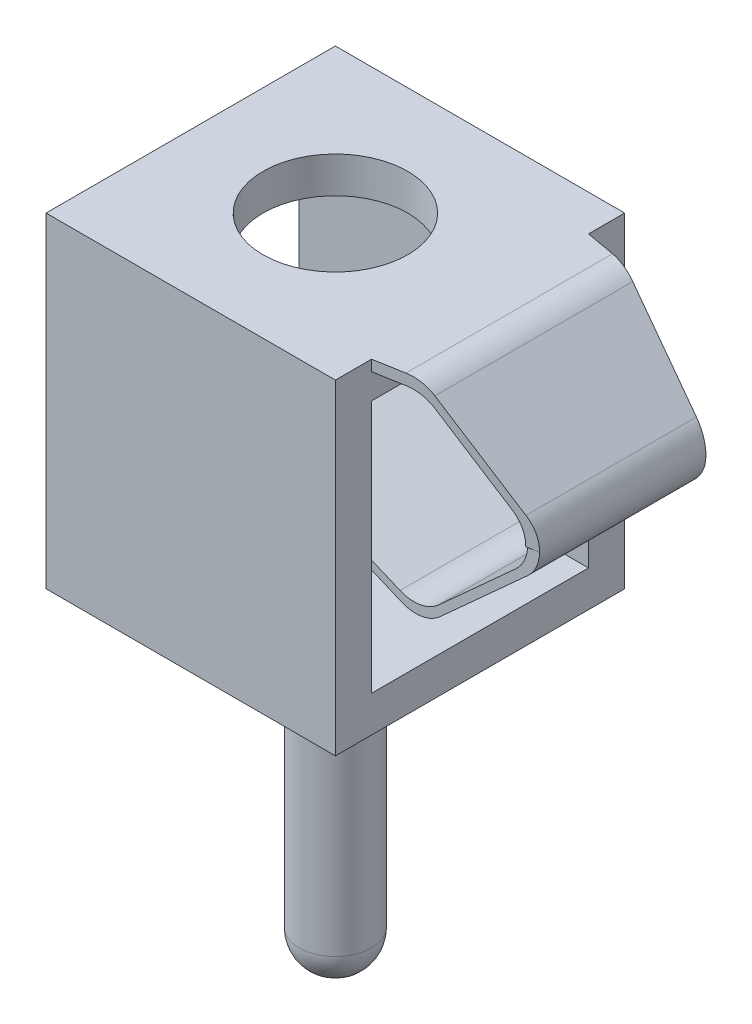
ISO-10303-21;
HEADER;
FILE_DESCRIPTION(('STEP AP214'),'2;1');
FILE_NAME('part.step','',(''),(''),'','','');
FILE_SCHEMA(('AUTOMOTIVE_DESIGN { 1 0 10303 214 1 1 1 1 }'));
ENDSEC;
DATA;
#1=APPLICATION_CONTEXT('core data for automotive mechanical design processes');
#2=APPLICATION_PROTOCOL_DEFINITION('international standard','automotive_design',2000,#1);
#3=PRODUCT_CONTEXT('',#1,'mechanical');
#4=PRODUCT('Part','Part','',(#3));
#5=PRODUCT_RELATED_PRODUCT_CATEGORY('part','',(#4));
#6=PRODUCT_DEFINITION_FORMATION('','',#4);
#7=PRODUCT_DEFINITION_CONTEXT('part definition',#1,'design');
#8=PRODUCT_DEFINITION('design','',#6,#7);
#9=PRODUCT_DEFINITION_SHAPE('','',#8);
#10=(LENGTH_UNIT() NAMED_UNIT(*) SI_UNIT(.MILLI.,.METRE.));
#11=(NAMED_UNIT(*) PLANE_ANGLE_UNIT() SI_UNIT($,.RADIAN.));
#12=(NAMED_UNIT(*) SI_UNIT($,.STERADIAN.) SOLID_ANGLE_UNIT());
#13=UNCERTAINTY_MEASURE_WITH_UNIT(LENGTH_MEASURE(1.E-05),#10,'distance_accuracy_value','');
#14=(GEOMETRIC_REPRESENTATION_CONTEXT(3) GLOBAL_UNCERTAINTY_ASSIGNED_CONTEXT((#13)) GLOBAL_UNIT_ASSIGNED_CONTEXT((#10,
#11,#12)) REPRESENTATION_CONTEXT('',''));
#15=CARTESIAN_POINT('',(0.,0.,0.));
#16=DIRECTION('',(0.,0.,1.));
#17=DIRECTION('',(1.,0.,0.));
#18=AXIS2_PLACEMENT_3D('',#15,#16,#17);
#19=CARTESIAN_POINT('',(5.47325224870173,0.758594498832904,-6.85820493129034));
#20=DIRECTION('',(0.,0.,1.));
#21=DIRECTION('',(1.,0.,0.));
#22=AXIS2_PLACEMENT_3D('',#19,#20,#21);
#23=CYLINDRICAL_SURFACE('',#22,0.500000000000002);
#24=DIRECTION('',(0.,0.,1.));
#25=VECTOR('',#24,1.);
#26=CARTESIAN_POINT('',(5.80889638246924,0.387996312831595,-6.85820493129034));
#27=LINE('',#26,#25);
#28=CARTESIAN_POINT('',(5.80889638246924,0.387996312831597,-1.15001310263475));
#29=VERTEX_POINT('',#28);
#30=CARTESIAN_POINT('',(5.80889638246924,0.387996312831597,1.15001310263475));
#31=VERTEX_POINT('',#30);
#32=EDGE_CURVE('E255',#29,#31,#27,.T.);
#33=ORIENTED_EDGE('',*,*,#32,.F.);
#34=CARTESIAN_POINT('',(5.47325224870173,0.758594498832904,-1.15001310263475));
#35=DIRECTION('',(0.,0.,-1.));
#36=DIRECTION('',(0.,1.,0.));
#37=AXIS2_PLACEMENT_3D('',#34,#35,#36);
#38=CIRCLE('',#37,0.500000000000002);
#39=CARTESIAN_POINT('',(5.97317837783464,0.75,-1.15001310263475));
#40=VERTEX_POINT('',#39);
#41=EDGE_CURVE('E243',#29,#40,#38,.F.);
#42=ORIENTED_EDGE('',*,*,#41,.T.);
#43=CARTESIAN_POINT('',(5.47325224870173,0.758594498832904,-1.23868607655972));
#44=DIRECTION('',(-0.174646166467987,0.,0.984631259171694));
#45=DIRECTION('',(0.984631259171694,0.,0.174646166467987));
#46=AXIS2_PLACEMENT_3D('',#43,#44,#45);
#47=ELLIPSE('',#46,0.507804312876091,0.500000000000002);
#48=CARTESIAN_POINT('',(5.81318688294126,1.12526116549957,-1.17839113856479));
#49=VERTEX_POINT('',#48);
#50=EDGE_CURVE('E252',#49,#40,#47,.F.);
#51=ORIENTED_EDGE('',*,*,#50,.F.);
#52=DIRECTION('',(0.,0.,1.));
#53=VECTOR('',#52,1.);
#54=CARTESIAN_POINT('',(5.81318688294126,1.12526116549957,-6.85820493129034));
#55=LINE('',#54,#53);
#56=CARTESIAN_POINT('',(5.81318688294126,1.12526116549957,1.17839113856479));
#57=VERTEX_POINT('',#56);
#58=EDGE_CURVE('E282',#49,#57,#55,.T.);
#59=ORIENTED_EDGE('',*,*,#58,.T.);
#60=CARTESIAN_POINT('',(5.47325224870173,0.758594498832904,1.23868607655972));
#61=DIRECTION('',(-0.174646166467987,0.,-0.984631259171694));
#62=DIRECTION('',(-0.984631259171694,0.,0.174646166467987));
#63=AXIS2_PLACEMENT_3D('',#60,#61,#62);
#64=ELLIPSE('',#63,0.507804312876091,0.500000000000002);
#65=CARTESIAN_POINT('',(5.97317837783464,0.75,1.15001310263475));
#66=VERTEX_POINT('',#65);
#67=EDGE_CURVE('E521',#66,#57,#64,.F.);
#68=ORIENTED_EDGE('',*,*,#67,.F.);
#69=CARTESIAN_POINT('',(5.47325224870173,0.758594498832904,1.15001310263475));
#70=DIRECTION('',(0.,0.,1.));
#71=DIRECTION('',(0.,-1.,0.));
#72=AXIS2_PLACEMENT_3D('',#69,#70,#71);
#73=CIRCLE('',#72,0.500000000000002);
#74=EDGE_CURVE('E540',#66,#31,#73,.F.);
#75=ORIENTED_EDGE('',*,*,#74,.T.);
#76=EDGE_LOOP('',(#33,#42,#51,#59,#68,#75));
#77=FACE_BOUND('',#76,.T.);
#78=ADVANCED_FACE('F45',(#77),#23,.T.);
#79=CARTESIAN_POINT('',(5.80889638246924,0.387996312831597,-6.85820493129034));
#80=DIRECTION('',(0.671288267535008,-0.741196372002621,0.));
#81=DIRECTION('',(0.741196372002621,0.671288267535008,0.));
#82=AXIS2_PLACEMENT_3D('',#79,#80,#81);
#83=PLANE('',#82);
#84=DIRECTION('',(0.,0.,1.));
#85=VECTOR('',#84,1.);
#86=CARTESIAN_POINT('',(4.59643948633741,-0.710104163653645,-6.85820493129034));
#87=LINE('',#86,#85);
#88=CARTESIAN_POINT('',(4.59643948633741,-0.710104163653642,-1.15001310263475));
#89=VERTEX_POINT('',#88);
#90=CARTESIAN_POINT('',(4.59643948633741,-0.710104163653642,1.15001310263475));
#91=VERTEX_POINT('',#90);
#92=EDGE_CURVE('E285',#89,#91,#87,.T.);
#93=ORIENTED_EDGE('',*,*,#92,.F.);
#94=DIRECTION('',(0.741196372002621,0.671288267535008,0.));
#95=VECTOR('',#94,1.);
#96=CARTESIAN_POINT('',(5.80889638246924,0.387996312831596,-1.15001310263475));
#97=LINE('',#96,#95);
#98=EDGE_CURVE('E256',#89,#29,#97,.T.);
#99=ORIENTED_EDGE('',*,*,#98,.T.);
#100=ORIENTED_EDGE('',*,*,#32,.T.);
#101=DIRECTION('',(-0.741196372002621,-0.671288267535008,0.));
#102=VECTOR('',#101,1.);
#103=CARTESIAN_POINT('',(5.80889638246924,0.387996312831596,1.15001310263475));
#104=LINE('',#103,#102);
#105=EDGE_CURVE('E542',#31,#91,#104,.T.);
#106=ORIENTED_EDGE('',*,*,#105,.T.);
#107=EDGE_LOOP('',(#93,#99,#100,#106));
#108=FACE_BOUND('',#107,.T.);
#109=ADVANCED_FACE('F392',(#108),#83,.T.);
#110=CARTESIAN_POINT('',(4.2607953525699,-0.339505977652333,-6.85820493129034));
#111=DIRECTION('',(0.,0.,1.));
#112=DIRECTION('',(1.,0.,0.));
#113=AXIS2_PLACEMENT_3D('',#110,#111,#112);
#114=CYLINDRICAL_SURFACE('',#113,0.500000000000002);
#115=DIRECTION('',(0.,0.,1.));
#116=VECTOR('',#115,1.);
#117=CARTESIAN_POINT('',(4.06676867111155,-0.800324430931128,-6.85820493129034));
#118=LINE('',#117,#116);
#119=CARTESIAN_POINT('',(4.06676867111155,-0.800324430931124,-1.15001310263475));
#120=VERTEX_POINT('',#119);
#121=CARTESIAN_POINT('',(4.06676867111155,-0.800324430931124,1.15001310263475));
#122=VERTEX_POINT('',#121);
#123=EDGE_CURVE('E287',#120,#122,#118,.T.);
#124=ORIENTED_EDGE('',*,*,#123,.F.);
#125=CARTESIAN_POINT('',(4.2607953525699,-0.339505977652333,-1.15001310263475));
#126=DIRECTION('',(0.,0.,-1.));
#127=DIRECTION('',(0.,1.,0.));
#128=AXIS2_PLACEMENT_3D('',#125,#126,#127);
#129=CIRCLE('',#128,0.500000000000002);
#130=EDGE_CURVE('E570',#120,#89,#129,.F.);
#131=ORIENTED_EDGE('',*,*,#130,.T.);
#132=ORIENTED_EDGE('',*,*,#92,.T.);
#133=CARTESIAN_POINT('',(4.2607953525699,-0.339505977652333,1.15001310263475));
#134=DIRECTION('',(0.,0.,1.));
#135=DIRECTION('',(0.,-1.,0.));
#136=AXIS2_PLACEMENT_3D('',#133,#134,#135);
#137=CIRCLE('',#136,0.500000000000002);
#138=EDGE_CURVE('E547',#91,#122,#137,.F.);
#139=ORIENTED_EDGE('',*,*,#138,.T.);
#140=EDGE_LOOP('',(#124,#131,#132,#139));
#141=FACE_BOUND('',#140,.T.);
#142=ADVANCED_FACE('F397',(#141),#114,.T.);
#143=CARTESIAN_POINT('',(4.06676867111155,-0.800324430931125,-6.85820493129034));
#144=DIRECTION('',(-0.38805336291672,-0.921636906557579,0.));
#145=DIRECTION('',(0.921636906557579,-0.38805336291672,0.));
#146=AXIS2_PLACEMENT_3D('',#143,#144,#145);
#147=PLANE('',#146);
#148=DIRECTION('',(0.,0.,1.));
#149=VECTOR('',#148,1.);
#150=CARTESIAN_POINT('',(1.59543168365403,0.240227029258746,-6.85820493129034));
#151=LINE('',#150,#149);
#152=CARTESIAN_POINT('',(1.59543168365403,0.240227029258746,-1.15001310263475));
#153=VERTEX_POINT('',#152);
#154=CARTESIAN_POINT('',(1.59543168365403,0.240227029258746,1.15001310263475));
#155=VERTEX_POINT('',#154);
#156=EDGE_CURVE('E289',#153,#155,#151,.T.);
#157=ORIENTED_EDGE('',*,*,#156,.F.);
#158=DIRECTION('',(0.921636906557579,-0.38805336291672,0.));
#159=VECTOR('',#158,1.);
#160=CARTESIAN_POINT('',(4.06676867111155,-0.800324430931125,-1.15001310263475));
#161=LINE('',#160,#159);
#162=EDGE_CURVE('E573',#153,#120,#161,.T.);
#163=ORIENTED_EDGE('',*,*,#162,.T.);
#164=ORIENTED_EDGE('',*,*,#123,.T.);
#165=DIRECTION('',(-0.921636906557579,0.38805336291672,0.));
#166=VECTOR('',#165,1.);
#167=CARTESIAN_POINT('',(4.06676867111155,-0.800324430931125,1.15001310263475));
#168=LINE('',#167,#166);
#169=EDGE_CURVE('E550',#122,#155,#168,.T.);
#170=ORIENTED_EDGE('',*,*,#169,.T.);
#171=EDGE_LOOP('',(#157,#163,#164,#170));
#172=FACE_BOUND('',#171,.T.);
#173=ADVANCED_FACE('F406',(#172),#147,.T.);
#174=CARTESIAN_POINT('',(1.59543168365403,0.359579888521796,-6.85820493129034));
#175=DIRECTION('',(-1.,0.,0.));
#176=DIRECTION('',(0.,0.,1.));
#177=AXIS2_PLACEMENT_3D('',#174,#175,#176);
#178=PLANE('',#177);
#179=DIRECTION('',(0.,0.,1.));
#180=VECTOR('',#179,1.);
#181=CARTESIAN_POINT('',(1.59543168365403,0.359579888521796,-6.85820493129034));
#182=LINE('',#181,#180);
#183=CARTESIAN_POINT('',(1.59543168365403,0.359579888521796,-1.15001310263475));
#184=VERTEX_POINT('',#183);
#185=CARTESIAN_POINT('',(1.59543168365403,0.359579888521796,1.15001310263475));
#186=VERTEX_POINT('',#185);
#187=EDGE_CURVE('E291',#184,#186,#182,.T.);
#188=ORIENTED_EDGE('',*,*,#187,.F.);
#189=DIRECTION('',(0.,-1.,0.));
#190=VECTOR('',#189,1.);
#191=CARTESIAN_POINT('',(1.59543168365403,0.359579888521796,-1.15001310263475));
#192=LINE('',#191,#190);
#193=EDGE_CURVE('E576',#184,#153,#192,.T.);
#194=ORIENTED_EDGE('',*,*,#193,.T.);
#195=ORIENTED_EDGE('',*,*,#156,.T.);
#196=DIRECTION('',(0.,1.,0.));
#197=VECTOR('',#196,1.);
#198=CARTESIAN_POINT('',(1.59543168365403,0.359579888521795,1.15001310263475));
#199=LINE('',#198,#197);
#200=EDGE_CURVE('E553',#155,#186,#199,.T.);
#201=ORIENTED_EDGE('',*,*,#200,.T.);
#202=EDGE_LOOP('',(#188,#194,#195,#201));
#203=FACE_BOUND('',#202,.T.);
#204=ADVANCED_FACE('F410',(#203),#178,.T.);
#205=CARTESIAN_POINT('',(4.04486831994504,-0.671750472926527,-6.85820493129034));
#206=DIRECTION('',(0.38805336291672,0.92163690655758,0.));
#207=DIRECTION('',(-0.92163690655758,0.38805336291672,0.));
#208=AXIS2_PLACEMENT_3D('',#205,#206,#207);
#209=PLANE('',#208);
#210=DIRECTION('',(0.,0.,1.));
#211=VECTOR('',#210,1.);
#212=CARTESIAN_POINT('',(4.04486831994504,-0.671750472926527,-6.85820493129034));
#213=LINE('',#212,#211);
#214=CARTESIAN_POINT('',(4.04486831994504,-0.671750472926531,-1.15001310263475));
#215=VERTEX_POINT('',#214);
#216=CARTESIAN_POINT('',(4.04486831994504,-0.67175047292653,1.15001310263475));
#217=VERTEX_POINT('',#216);
#218=EDGE_CURVE('E293',#215,#217,#213,.T.);
#219=ORIENTED_EDGE('',*,*,#218,.F.);
#220=DIRECTION('',(-0.92163690655758,0.38805336291672,0.));
#221=VECTOR('',#220,1.);
#222=CARTESIAN_POINT('',(4.04486831994504,-0.671750472926527,-1.15001310263475));
#223=LINE('',#222,#221);
#224=EDGE_CURVE('E579',#215,#184,#223,.T.);
#225=ORIENTED_EDGE('',*,*,#224,.T.);
#226=ORIENTED_EDGE('',*,*,#187,.T.);
#227=DIRECTION('',(0.92163690655758,-0.38805336291672,0.));
#228=VECTOR('',#227,1.);
#229=CARTESIAN_POINT('',(4.04486831994504,-0.671750472926527,1.15001310263475));
#230=LINE('',#229,#228);
#231=EDGE_CURVE('E556',#186,#217,#230,.T.);
#232=ORIENTED_EDGE('',*,*,#231,.T.);
#233=EDGE_LOOP('',(#219,#225,#226,#232));
#234=FACE_BOUND('',#233,.T.);
#235=ADVANCED_FACE('F414',(#234),#209,.T.);
#236=CARTESIAN_POINT('',(4.23889500140339,-0.210932019647736,-6.85820493129034));
#237=DIRECTION('',(0.,0.,1.));
#238=DIRECTION('',(1.,0.,0.));
#239=AXIS2_PLACEMENT_3D('',#236,#237,#238);
#240=CYLINDRICAL_SURFACE('',#239,0.500000000000002);
#241=DIRECTION('',(0.,0.,1.));
#242=VECTOR('',#241,1.);
#243=CARTESIAN_POINT('',(4.5745391351709,-0.581530205649044,-6.85820493129034));
#244=LINE('',#243,#242);
#245=CARTESIAN_POINT('',(4.5745391351709,-0.58153020564905,-1.15001310263475));
#246=VERTEX_POINT('',#245);
#247=CARTESIAN_POINT('',(4.5745391351709,-0.58153020564905,1.15001310263475));
#248=VERTEX_POINT('',#247);
#249=EDGE_CURVE('E295',#246,#248,#244,.T.);
#250=ORIENTED_EDGE('',*,*,#249,.F.);
#251=CARTESIAN_POINT('',(4.23889500140339,-0.210932019647736,-1.15001310263475));
#252=DIRECTION('',(0.,0.,-1.));
#253=DIRECTION('',(0.,1.,0.));
#254=AXIS2_PLACEMENT_3D('',#251,#252,#253);
#255=CIRCLE('',#254,0.500000000000002);
#256=EDGE_CURVE('E582',#246,#215,#255,.T.);
#257=ORIENTED_EDGE('',*,*,#256,.T.);
#258=ORIENTED_EDGE('',*,*,#218,.T.);
#259=CARTESIAN_POINT('',(4.23889500140339,-0.210932019647736,1.15001310263475));
#260=DIRECTION('',(0.,0.,1.));
#261=DIRECTION('',(0.,-1.,0.));
#262=AXIS2_PLACEMENT_3D('',#259,#260,#261);
#263=CIRCLE('',#262,0.500000000000002);
#264=EDGE_CURVE('E559',#217,#248,#263,.T.);
#265=ORIENTED_EDGE('',*,*,#264,.T.);
#266=EDGE_LOOP('',(#250,#257,#258,#265));
#267=FACE_BOUND('',#266,.T.);
#268=ADVANCED_FACE('F418',(#267),#240,.F.);
#269=CARTESIAN_POINT('',(5.64607854385029,0.388943828518693,-6.85820493129034));
#270=DIRECTION('',(-0.671288267535009,0.74119637200262,0.));
#271=DIRECTION('',(-0.74119637200262,-0.671288267535009,0.));
#272=AXIS2_PLACEMENT_3D('',#269,#270,#271);
#273=PLANE('',#272);
#274=DIRECTION('',(0.,0.,1.));
#275=VECTOR('',#274,1.);
#276=CARTESIAN_POINT('',(5.64607854385029,0.388943828518693,-6.85820493129034));
#277=LINE('',#276,#275);
#278=CARTESIAN_POINT('',(5.64607854385029,0.388943828518692,-1.15001310263475));
#279=VERTEX_POINT('',#278);
#280=CARTESIAN_POINT('',(5.64607854385029,0.388943828518692,1.15001310263475));
#281=VERTEX_POINT('',#280);
#282=EDGE_CURVE('E297',#279,#281,#277,.T.);
#283=ORIENTED_EDGE('',*,*,#282,.F.);
#284=DIRECTION('',(-0.74119637200262,-0.671288267535009,0.));
#285=VECTOR('',#284,1.);
#286=CARTESIAN_POINT('',(5.64607854385029,0.388943828518692,-1.15001310263475));
#287=LINE('',#286,#285);
#288=EDGE_CURVE('E585',#279,#246,#287,.T.);
#289=ORIENTED_EDGE('',*,*,#288,.T.);
#290=ORIENTED_EDGE('',*,*,#249,.T.);
#291=DIRECTION('',(0.74119637200262,0.671288267535009,0.));
#292=VECTOR('',#291,1.);
#293=CARTESIAN_POINT('',(5.64607854385029,0.388943828518692,1.15001310263475));
#294=LINE('',#293,#292);
#295=EDGE_CURVE('E562',#248,#281,#294,.T.);
#296=ORIENTED_EDGE('',*,*,#295,.T.);
#297=EDGE_LOOP('',(#283,#289,#290,#296));
#298=FACE_BOUND('',#297,.T.);
#299=ADVANCED_FACE('F386',(#298),#273,.T.);
#300=CARTESIAN_POINT('',(5.31043441008278,0.759542014520001,-6.85820493129034));
#301=DIRECTION('',(0.,0.,1.));
#302=DIRECTION('',(1.,0.,0.));
#303=AXIS2_PLACEMENT_3D('',#300,#301,#302);
#304=CYLINDRICAL_SURFACE('',#303,0.500000000000002);
#305=DIRECTION('',(0.,0.,1.));
#306=VECTOR('',#305,1.);
#307=CARTESIAN_POINT('',(5.81034335175007,0.75,-6.85820493129034));
#308=LINE('',#307,#306);
#309=CARTESIAN_POINT('',(5.81034335175007,0.75,-1.17889550181463));
#310=VERTEX_POINT('',#309);
#311=CARTESIAN_POINT('',(5.81034335175007,0.75,-1.15001310263475));
#312=VERTEX_POINT('',#311);
#313=EDGE_CURVE('E233',#310,#312,#308,.T.);
#314=ORIENTED_EDGE('',*,*,#313,.T.);
#315=CARTESIAN_POINT('',(5.31043441008278,0.759542014520001,-1.15001310263475));
#316=DIRECTION('',(0.,0.,-1.));
#317=DIRECTION('',(0.,1.,0.));
#318=AXIS2_PLACEMENT_3D('',#315,#316,#317);
#319=CIRCLE('',#318,0.500000000000002);
#320=EDGE_CURVE('E246',#312,#279,#319,.T.);
#321=ORIENTED_EDGE('',*,*,#320,.T.);
#322=ORIENTED_EDGE('',*,*,#282,.T.);
#323=CARTESIAN_POINT('',(5.31043441008278,0.759542014520001,1.15001310263475));
#324=DIRECTION('',(0.,0.,1.));
#325=DIRECTION('',(0.,-1.,0.));
#326=AXIS2_PLACEMENT_3D('',#323,#324,#325);
#327=CIRCLE('',#326,0.500000000000002);
#328=CARTESIAN_POINT('',(5.81034335175007,0.75,1.15001310263475));
#329=VERTEX_POINT('',#328);
#330=EDGE_CURVE('E537',#281,#329,#327,.T.);
#331=ORIENTED_EDGE('',*,*,#330,.T.);
#332=DIRECTION('',(0.,0.,1.));
#333=VECTOR('',#332,1.);
#334=CARTESIAN_POINT('',(5.81034335175007,0.75,-6.85820493129034));
#335=LINE('',#334,#333);
#336=CARTESIAN_POINT('',(5.81034335175007,0.75,1.17889550181463));
#337=VERTEX_POINT('',#336);
#338=EDGE_CURVE('E535',#329,#337,#335,.T.);
#339=ORIENTED_EDGE('',*,*,#338,.T.);
#340=CARTESIAN_POINT('',(5.31043441008278,0.759542014520001,1.26756542716182));
#341=DIRECTION('',(-0.174646166467987,0.,-0.984631259171694));
#342=DIRECTION('',(-0.984631259171694,0.,0.174646166467987));
#343=AXIS2_PLACEMENT_3D('',#340,#341,#342);
#344=ELLIPSE('',#343,0.50780431287609,0.500000000000002);
#345=CARTESIAN_POINT('',(5.65036904432231,1.12620868118667,1.20727048916688));
#346=VERTEX_POINT('',#345);
#347=EDGE_CURVE('E514',#346,#337,#344,.T.);
#348=ORIENTED_EDGE('',*,*,#347,.F.);
#349=DIRECTION('',(0.,0.,1.));
#350=VECTOR('',#349,1.);
#351=CARTESIAN_POINT('',(5.65036904432231,1.12620868118667,-6.85820493129034));
#352=LINE('',#351,#350);
#353=CARTESIAN_POINT('',(5.65036904432231,1.12620868118667,-1.20727048916688));
#354=VERTEX_POINT('',#353);
#355=EDGE_CURVE('E299',#354,#346,#352,.T.);
#356=ORIENTED_EDGE('',*,*,#355,.F.);
#357=CARTESIAN_POINT('',(5.31043441008278,0.759542014520001,-1.26756542716182));
#358=DIRECTION('',(-0.174646166467987,0.,0.984631259171694));
#359=DIRECTION('',(0.984631259171694,0.,0.174646166467987));
#360=AXIS2_PLACEMENT_3D('',#357,#358,#359);
#361=ELLIPSE('',#360,0.50780431287609,0.500000000000002);
#362=EDGE_CURVE('E261',#310,#354,#361,.T.);
#363=ORIENTED_EDGE('',*,*,#362,.F.);
#364=EDGE_LOOP('',(#314,#321,#322,#331,#339,#348,#356,#363));
#365=FACE_BOUND('',#364,.T.);
#366=ADVANCED_FACE('F376',(#365),#304,.F.);
#367=CARTESIAN_POINT('',(4.,-2.25,2.));
#368=DIRECTION('',(0.,1.,0.));
#369=DIRECTION('',(0.,0.,1.));
#370=AXIS2_PLACEMENT_3D('',#367,#368,#369);
#371=PLANE('',#370);
#372=DIRECTION('',(0.,0.,-1.));
#373=VECTOR('',#372,1.);
#374=CARTESIAN_POINT('',(0.,-2.25,2.));
#375=LINE('',#374,#373);
#376=CARTESIAN_POINT('',(0.,-2.25,2.));
#377=VERTEX_POINT('',#376);
#378=CARTESIAN_POINT('',(0.,-2.25,-2.));
#379=VERTEX_POINT('',#378);
#380=EDGE_CURVE('E341',#377,#379,#375,.T.);
#381=ORIENTED_EDGE('',*,*,#380,.T.);
#382=DIRECTION('',(-1.,0.,0.));
#383=VECTOR('',#382,1.);
#384=CARTESIAN_POINT('',(4.,-2.25,-2.));
#385=LINE('',#384,#383);
#386=CARTESIAN_POINT('',(4.,-2.25,-2.));
#387=VERTEX_POINT('',#386);
#388=EDGE_CURVE('E349',#387,#379,#385,.T.);
#389=ORIENTED_EDGE('',*,*,#388,.F.);
#390=DIRECTION('',(0.,0.,-1.));
#391=VECTOR('',#390,1.);
#392=CARTESIAN_POINT('',(4.,-2.25,2.));
#393=LINE('',#392,#391);
#394=CARTESIAN_POINT('',(4.,-2.25,2.));
#395=VERTEX_POINT('',#394);
#396=EDGE_CURVE('E347',#395,#387,#393,.T.);
#397=ORIENTED_EDGE('',*,*,#396,.F.);
#398=DIRECTION('',(-1.,0.,0.));
#399=VECTOR('',#398,1.);
#400=CARTESIAN_POINT('',(4.,-2.25,2.));
#401=LINE('',#400,#399);
#402=EDGE_CURVE('E359',#395,#377,#401,.T.);
#403=ORIENTED_EDGE('',*,*,#402,.T.);
#404=EDGE_LOOP('',(#381,#389,#397,#403));
#405=FACE_BOUND('',#404,.T.);
#406=CARTESIAN_POINT('',(2.,-2.25,0.));
#407=DIRECTION('',(0.,1.,0.));
#408=DIRECTION('',(0.,0.,1.));
#409=AXIS2_PLACEMENT_3D('',#406,#407,#408);
#410=CIRCLE('',#409,0.5);
#411=CARTESIAN_POINT('',(2.,-2.25,0.5));
#412=VERTEX_POINT('',#411);
#413=EDGE_CURVE('E54',#412,#412,#410,.F.);
#414=ORIENTED_EDGE('',*,*,#413,.F.);
#415=EDGE_LOOP('',(#414));
#416=FACE_BOUND('',#415,.T.);
#417=ADVANCED_FACE('F373',(#405,#416),#371,.F.);
#418=CARTESIAN_POINT('',(4.,0.,0.));
#419=DIRECTION('',(1.,0.,0.));
#420=DIRECTION('',(0.,0.,-1.));
#421=AXIS2_PLACEMENT_3D('',#418,#419,#420);
#422=PLANE('',#421);
#423=DIRECTION('',(0.,0.,1.));
#424=VECTOR('',#423,1.);
#425=CARTESIAN_POINT('',(4.,2.1,-6.85820493129034));
#426=LINE('',#425,#424);
#427=CARTESIAN_POINT('',(4.,2.1,-1.5));
#428=VERTEX_POINT('',#427);
#429=CARTESIAN_POINT('',(4.,2.1,1.5));
#430=VERTEX_POINT('',#429);
#431=EDGE_CURVE('E276',#428,#430,#426,.T.);
#432=ORIENTED_EDGE('',*,*,#431,.T.);
#433=DIRECTION('',(0.,-1.,0.));
#434=VECTOR('',#433,1.);
#435=CARTESIAN_POINT('',(4.,2.25,1.5));
#436=LINE('',#435,#434);
#437=CARTESIAN_POINT('',(4.,2.25,1.5));
#438=VERTEX_POINT('',#437);
#439=EDGE_CURVE('E270',#438,#430,#436,.T.);
#440=ORIENTED_EDGE('',*,*,#439,.F.);
#441=DIRECTION('',(0.,0.,1.));
#442=VECTOR('',#441,1.);
#443=CARTESIAN_POINT('',(4.,2.25,2.));
#444=LINE('',#443,#442);
#445=CARTESIAN_POINT('',(4.,2.25,2.));
#446=VERTEX_POINT('',#445);
#447=EDGE_CURVE('E340',#438,#446,#444,.T.);
#448=ORIENTED_EDGE('',*,*,#447,.T.);
#449=DIRECTION('',(0.,-1.,0.));
#450=VECTOR('',#449,1.);
#451=CARTESIAN_POINT('',(4.,2.25,2.));
#452=LINE('',#451,#450);
#453=EDGE_CURVE('E345',#446,#395,#452,.T.);
#454=ORIENTED_EDGE('',*,*,#453,.T.);
#455=ORIENTED_EDGE('',*,*,#396,.T.);
#456=DIRECTION('',(0.,1.,0.));
#457=VECTOR('',#456,1.);
#458=CARTESIAN_POINT('',(4.,2.25,-2.));
#459=LINE('',#458,#457);
#460=CARTESIAN_POINT('',(4.,2.25,-2.));
#461=VERTEX_POINT('',#460);
#462=EDGE_CURVE('E337',#387,#461,#459,.T.);
#463=ORIENTED_EDGE('',*,*,#462,.T.);
#464=CARTESIAN_POINT('',(4.,2.25,-1.5));
#465=VERTEX_POINT('',#464);
#466=EDGE_CURVE('E342',#461,#465,#444,.T.);
#467=ORIENTED_EDGE('',*,*,#466,.T.);
#468=DIRECTION('',(0.,1.,0.));
#469=VECTOR('',#468,1.);
#470=CARTESIAN_POINT('',(4.,2.25,-1.5));
#471=LINE('',#470,#469);
#472=EDGE_CURVE('E271',#428,#465,#471,.T.);
#473=ORIENTED_EDGE('',*,*,#472,.F.);
#474=EDGE_LOOP('',(#432,#440,#448,#454,#455,#463,#467,#473));
#475=FACE_BOUND('',#474,.T.);
#476=DIRECTION('',(0.,0.,1.));
#477=VECTOR('',#476,1.);
#478=CARTESIAN_POINT('',(4.,1.75,1.5));
#479=LINE('',#478,#477);
#480=CARTESIAN_POINT('',(4.,1.75,-1.5));
#481=VERTEX_POINT('',#480);
#482=CARTESIAN_POINT('',(4.,1.75,1.5));
#483=VERTEX_POINT('',#482);
#484=EDGE_CURVE('E314',#481,#483,#479,.T.);
#485=ORIENTED_EDGE('',*,*,#484,.F.);
#486=DIRECTION('',(0.,1.,0.));
#487=VECTOR('',#486,1.);
#488=CARTESIAN_POINT('',(4.,1.75,-1.5));
#489=LINE('',#488,#487);
#490=CARTESIAN_POINT('',(4.,-1.75,-1.5));
#491=VERTEX_POINT('',#490);
#492=EDGE_CURVE('E312',#491,#481,#489,.T.);
#493=ORIENTED_EDGE('',*,*,#492,.F.);
#494=DIRECTION('',(0.,0.,-1.));
#495=VECTOR('',#494,1.);
#496=CARTESIAN_POINT('',(4.,-1.75,1.5));
#497=LINE('',#496,#495);
#498=CARTESIAN_POINT('',(4.,-1.75,1.5));
#499=VERTEX_POINT('',#498);
#500=EDGE_CURVE('E318',#499,#491,#497,.T.);
#501=ORIENTED_EDGE('',*,*,#500,.F.);
#502=DIRECTION('',(0.,-1.,0.));
#503=VECTOR('',#502,1.);
#504=CARTESIAN_POINT('',(4.,1.75,1.5));
#505=LINE('',#504,#503);
#506=EDGE_CURVE('E61',#483,#499,#505,.T.);
#507=ORIENTED_EDGE('',*,*,#506,.F.);
#508=EDGE_LOOP('',(#485,#493,#501,#507));
#509=FACE_BOUND('',#508,.T.);
#510=ADVANCED_FACE('F375',(#475,#509),#422,.T.);
#511=CARTESIAN_POINT('',(0.,0.,0.));
#512=DIRECTION('',(1.,0.,0.));
#513=DIRECTION('',(0.,0.,-1.));
#514=AXIS2_PLACEMENT_3D('',#511,#512,#513);
#515=PLANE('',#514);
#516=DIRECTION('',(0.,1.,0.));
#517=VECTOR('',#516,1.);
#518=CARTESIAN_POINT('',(0.,2.25,-2.));
#519=LINE('',#518,#517);
#520=CARTESIAN_POINT('',(0.,2.25,-2.));
#521=VERTEX_POINT('',#520);
#522=EDGE_CURVE('E336',#379,#521,#519,.T.);
#523=ORIENTED_EDGE('',*,*,#522,.F.);
#524=ORIENTED_EDGE('',*,*,#380,.F.);
#525=DIRECTION('',(0.,-1.,0.));
#526=VECTOR('',#525,1.);
#527=CARTESIAN_POINT('',(0.,2.25,2.));
#528=LINE('',#527,#526);
#529=CARTESIAN_POINT('',(0.,2.25,2.));
#530=VERTEX_POINT('',#529);
#531=EDGE_CURVE('E354',#530,#377,#528,.T.);
#532=ORIENTED_EDGE('',*,*,#531,.F.);
#533=DIRECTION('',(0.,0.,1.));
#534=VECTOR('',#533,1.);
#535=CARTESIAN_POINT('',(0.,2.25,2.));
#536=LINE('',#535,#534);
#537=EDGE_CURVE('E352',#521,#530,#536,.T.);
#538=ORIENTED_EDGE('',*,*,#537,.F.);
#539=EDGE_LOOP('',(#523,#524,#532,#538));
#540=FACE_BOUND('',#539,.T.);
#541=DIRECTION('',(0.,1.,0.));
#542=VECTOR('',#541,1.);
#543=CARTESIAN_POINT('',(0.,1.75,-1.5));
#544=LINE('',#543,#542);
#545=CARTESIAN_POINT('',(0.,-1.75,-1.5));
#546=VERTEX_POINT('',#545);
#547=CARTESIAN_POINT('',(0.,1.75,-1.5));
#548=VERTEX_POINT('',#547);
#549=EDGE_CURVE('E69',#546,#548,#544,.T.);
#550=ORIENTED_EDGE('',*,*,#549,.T.);
#551=DIRECTION('',(0.,0.,1.));
#552=VECTOR('',#551,1.);
#553=CARTESIAN_POINT('',(0.,1.75,1.5));
#554=LINE('',#553,#552);
#555=CARTESIAN_POINT('',(0.,1.75,1.5));
#556=VERTEX_POINT('',#555);
#557=EDGE_CURVE('E322',#548,#556,#554,.T.);
#558=ORIENTED_EDGE('',*,*,#557,.T.);
#559=DIRECTION('',(0.,-1.,0.));
#560=VECTOR('',#559,1.);
#561=CARTESIAN_POINT('',(0.,1.75,1.5));
#562=LINE('',#561,#560);
#563=CARTESIAN_POINT('',(0.,-1.75,1.5));
#564=VERTEX_POINT('',#563);
#565=EDGE_CURVE('E325',#556,#564,#562,.T.);
#566=ORIENTED_EDGE('',*,*,#565,.T.);
#567=DIRECTION('',(0.,0.,-1.));
#568=VECTOR('',#567,1.);
#569=CARTESIAN_POINT('',(0.,-1.75,1.5));
#570=LINE('',#569,#568);
#571=EDGE_CURVE('E315',#564,#546,#570,.T.);
#572=ORIENTED_EDGE('',*,*,#571,.T.);
#573=EDGE_LOOP('',(#550,#558,#566,#572));
#574=FACE_BOUND('',#573,.T.);
#575=ADVANCED_FACE('F383',(#540,#574),#515,.F.);
#576=CARTESIAN_POINT('',(4.,2.25,-2.));
#577=DIRECTION('',(0.,0.,1.));
#578=DIRECTION('',(0.,-1.,0.));
#579=AXIS2_PLACEMENT_3D('',#576,#577,#578);
#580=PLANE('',#579);
#581=ORIENTED_EDGE('',*,*,#522,.T.);
#582=DIRECTION('',(-1.,0.,0.));
#583=VECTOR('',#582,1.);
#584=CARTESIAN_POINT('',(4.,2.25,-2.));
#585=LINE('',#584,#583);
#586=EDGE_CURVE('E365',#461,#521,#585,.T.);
#587=ORIENTED_EDGE('',*,*,#586,.F.);
#588=ORIENTED_EDGE('',*,*,#462,.F.);
#589=ORIENTED_EDGE('',*,*,#388,.T.);
#590=EDGE_LOOP('',(#581,#587,#588,#589));
#591=FACE_BOUND('',#590,.T.);
#592=ADVANCED_FACE('F461',(#591),#580,.F.);
#593=CARTESIAN_POINT('',(4.,2.25,2.));
#594=DIRECTION('',(0.,-1.,0.));
#595=DIRECTION('',(0.,0.,-1.));
#596=AXIS2_PLACEMENT_3D('',#593,#594,#595);
#597=PLANE('',#596);
#598=CARTESIAN_POINT('',(2.,2.25,0.));
#599=DIRECTION('',(0.,1.,0.));
#600=DIRECTION('',(0.,0.,1.));
#601=AXIS2_PLACEMENT_3D('',#598,#599,#600);
#602=CIRCLE('',#601,1.);
#603=CARTESIAN_POINT('',(2.,2.25,1.));
#604=VERTEX_POINT('',#603);
#605=EDGE_CURVE('E273',#604,#604,#602,.T.);
#606=ORIENTED_EDGE('',*,*,#605,.F.);
#607=EDGE_LOOP('',(#606));
#608=FACE_BOUND('',#607,.T.);
#609=ORIENTED_EDGE('',*,*,#447,.F.);
#610=DIRECTION('',(-0.984631259171694,0.,0.174646166467987));
#611=VECTOR('',#610,1.);
#612=CARTESIAN_POINT('',(4.,2.25,1.5));
#613=LINE('',#612,#611);
#614=CARTESIAN_POINT('',(4.40388386486181,2.25,1.42836224927926));
#615=VERTEX_POINT('',#614);
#616=EDGE_CURVE('E502',#615,#438,#613,.T.);
#617=ORIENTED_EDGE('',*,*,#616,.F.);
#618=DIRECTION('',(0.,0.,1.));
#619=VECTOR('',#618,1.);
#620=CARTESIAN_POINT('',(4.40388386486181,2.25,-6.85820493129034));
#621=LINE('',#620,#619);
#622=CARTESIAN_POINT('',(4.40388386486181,2.25,-1.42836224927926));
#623=VERTEX_POINT('',#622);
#624=EDGE_CURVE('E274',#623,#615,#621,.T.);
#625=ORIENTED_EDGE('',*,*,#624,.F.);
#626=DIRECTION('',(0.984631259171694,0.,0.174646166467987));
#627=VECTOR('',#626,1.);
#628=CARTESIAN_POINT('',(4.,2.25,-1.5));
#629=LINE('',#628,#627);
#630=EDGE_CURVE('E238',#465,#623,#629,.T.);
#631=ORIENTED_EDGE('',*,*,#630,.F.);
#632=ORIENTED_EDGE('',*,*,#466,.F.);
#633=ORIENTED_EDGE('',*,*,#586,.T.);
#634=ORIENTED_EDGE('',*,*,#537,.T.);
#635=DIRECTION('',(-1.,0.,0.));
#636=VECTOR('',#635,1.);
#637=CARTESIAN_POINT('',(4.,2.25,2.));
#638=LINE('',#637,#636);
#639=EDGE_CURVE('E362',#446,#530,#638,.T.);
#640=ORIENTED_EDGE('',*,*,#639,.F.);
#641=EDGE_LOOP('',(#609,#617,#625,#631,#632,#633,#634,#640));
#642=FACE_BOUND('',#641,.T.);
#643=ADVANCED_FACE('F466',(#608,#642),#597,.F.);
#644=CARTESIAN_POINT('',(4.,2.25,2.));
#645=DIRECTION('',(0.,0.,-1.));
#646=DIRECTION('',(0.,1.,0.));
#647=AXIS2_PLACEMENT_3D('',#644,#645,#646);
#648=PLANE('',#647);
#649=ORIENTED_EDGE('',*,*,#531,.T.);
#650=ORIENTED_EDGE('',*,*,#402,.F.);
#651=ORIENTED_EDGE('',*,*,#453,.F.);
#652=ORIENTED_EDGE('',*,*,#639,.T.);
#653=EDGE_LOOP('',(#649,#650,#651,#652));
#654=FACE_BOUND('',#653,.T.);
#655=ADVANCED_FACE('F459',(#654),#648,.F.);
#656=CARTESIAN_POINT('',(4.,1.75,-1.5));
#657=DIRECTION('',(0.,0.,1.));
#658=DIRECTION('',(0.,-1.,0.));
#659=AXIS2_PLACEMENT_3D('',#656,#657,#658);
#660=PLANE('',#659);
#661=DIRECTION('',(-1.,0.,0.));
#662=VECTOR('',#661,1.);
#663=CARTESIAN_POINT('',(4.,1.75,-1.5));
#664=LINE('',#663,#662);
#665=EDGE_CURVE('E334',#481,#548,#664,.T.);
#666=ORIENTED_EDGE('',*,*,#665,.T.);
#667=ORIENTED_EDGE('',*,*,#549,.F.);
#668=DIRECTION('',(-1.,0.,0.));
#669=VECTOR('',#668,1.);
#670=CARTESIAN_POINT('',(4.,-1.75,-1.5));
#671=LINE('',#670,#669);
#672=EDGE_CURVE('E320',#491,#546,#671,.T.);
#673=ORIENTED_EDGE('',*,*,#672,.F.);
#674=ORIENTED_EDGE('',*,*,#492,.T.);
#675=EDGE_LOOP('',(#666,#667,#673,#674));
#676=FACE_BOUND('',#675,.T.);
#677=ADVANCED_FACE('F456',(#676),#660,.T.);
#678=CARTESIAN_POINT('',(4.,1.75,1.5));
#679=DIRECTION('',(0.,-1.,0.));
#680=DIRECTION('',(0.,0.,-1.));
#681=AXIS2_PLACEMENT_3D('',#678,#679,#680);
#682=PLANE('',#681);
#683=CARTESIAN_POINT('',(2.,1.75,0.));
#684=DIRECTION('',(0.,-1.,0.));
#685=DIRECTION('',(0.,0.,-1.));
#686=AXIS2_PLACEMENT_3D('',#683,#684,#685);
#687=CIRCLE('',#686,1.);
#688=CARTESIAN_POINT('',(2.,1.75,-1.));
#689=VERTEX_POINT('',#688);
#690=EDGE_CURVE('E49',#689,#689,#687,.T.);
#691=ORIENTED_EDGE('',*,*,#690,.F.);
#692=EDGE_LOOP('',(#691));
#693=FACE_BOUND('',#692,.T.);
#694=ORIENTED_EDGE('',*,*,#557,.F.);
#695=ORIENTED_EDGE('',*,*,#665,.F.);
#696=ORIENTED_EDGE('',*,*,#484,.T.);
#697=DIRECTION('',(-1.,0.,0.));
#698=VECTOR('',#697,1.);
#699=CARTESIAN_POINT('',(4.,1.75,1.5));
#700=LINE('',#699,#698);
#701=EDGE_CURVE('E332',#483,#556,#700,.T.);
#702=ORIENTED_EDGE('',*,*,#701,.T.);
#703=EDGE_LOOP('',(#694,#695,#696,#702));
#704=FACE_BOUND('',#703,.T.);
#705=ADVANCED_FACE('F453',(#693,#704),#682,.T.);
#706=CARTESIAN_POINT('',(4.,1.75,1.5));
#707=DIRECTION('',(0.,0.,-1.));
#708=DIRECTION('',(0.,1.,0.));
#709=AXIS2_PLACEMENT_3D('',#706,#707,#708);
#710=PLANE('',#709);
#711=ORIENTED_EDGE('',*,*,#506,.T.);
#712=DIRECTION('',(-1.,0.,0.));
#713=VECTOR('',#712,1.);
#714=CARTESIAN_POINT('',(4.,-1.75,1.5));
#715=LINE('',#714,#713);
#716=EDGE_CURVE('E330',#499,#564,#715,.T.);
#717=ORIENTED_EDGE('',*,*,#716,.T.);
#718=ORIENTED_EDGE('',*,*,#565,.F.);
#719=ORIENTED_EDGE('',*,*,#701,.F.);
#720=EDGE_LOOP('',(#711,#717,#718,#719));
#721=FACE_BOUND('',#720,.T.);
#722=ADVANCED_FACE('F449',(#721),#710,.T.);
#723=CARTESIAN_POINT('',(4.,-1.75,1.5));
#724=DIRECTION('',(0.,1.,0.));
#725=DIRECTION('',(0.,0.,1.));
#726=AXIS2_PLACEMENT_3D('',#723,#724,#725);
#727=PLANE('',#726);
#728=ORIENTED_EDGE('',*,*,#571,.F.);
#729=ORIENTED_EDGE('',*,*,#716,.F.);
#730=ORIENTED_EDGE('',*,*,#500,.T.);
#731=ORIENTED_EDGE('',*,*,#672,.T.);
#732=EDGE_LOOP('',(#728,#729,#730,#731));
#733=FACE_BOUND('',#732,.T.);
#734=ADVANCED_FACE('F445',(#733),#727,.T.);
#735=CARTESIAN_POINT('',(2.,-6.8,0.));
#736=DIRECTION('',(0.,1.,0.));
#737=DIRECTION('',(0.,0.,1.));
#738=AXIS2_PLACEMENT_3D('',#735,#736,#737);
#739=CYLINDRICAL_SURFACE('',#738,0.5);
#740=CARTESIAN_POINT('',(2.,-6.3,0.));
#741=DIRECTION('',(0.,1.,0.));
#742=DIRECTION('',(0.,0.,1.));
#743=AXIS2_PLACEMENT_3D('',#740,#741,#742);
#744=CIRCLE('',#743,0.5);
#745=CARTESIAN_POINT('',(2.,-6.3,0.5));
#746=VERTEX_POINT('',#745);
#747=EDGE_CURVE('E13',#746,#746,#744,.T.);
#748=ORIENTED_EDGE('',*,*,#747,.T.);
#749=EDGE_LOOP('',(#748));
#750=FACE_BOUND('',#749,.T.);
#751=ORIENTED_EDGE('',*,*,#413,.T.);
#752=EDGE_LOOP('',(#751));
#753=FACE_BOUND('',#752,.T.);
#754=ADVANCED_FACE('F371',(#750,#753),#739,.T.);
#755=CARTESIAN_POINT('',(2.,-6.3,0.));
#756=DIRECTION('',(0.,0.,1.));
#757=DIRECTION('',(1.,0.,0.));
#758=AXIS2_PLACEMENT_3D('',#755,#756,#757);
#759=SPHERICAL_SURFACE('',#758,0.5);
#760=CARTESIAN_POINT('',(2.,-6.3,0.));
#761=DIRECTION('',(0.,1.,0.));
#762=DIRECTION('',(0.,0.,1.));
#763=AXIS2_PLACEMENT_3D('',#760,#761,#762);
#764=SPHERICAL_SURFACE('',#763,0.5);
#765=ORIENTED_EDGE('',*,*,#747,.F.);
#766=EDGE_LOOP('',(#765));
#767=FACE_BOUND('',#766,.T.);
#768=ADVANCED_FACE('F47',(#767),#764,.T.);
#769=CARTESIAN_POINT('',(2.,-0.3,0.));
#770=DIRECTION('',(0.,1.,0.));
#771=DIRECTION('',(0.,0.,1.));
#772=AXIS2_PLACEMENT_3D('',#769,#770,#771);
#773=CYLINDRICAL_SURFACE('',#772,1.);
#774=ORIENTED_EDGE('',*,*,#690,.T.);
#775=EDGE_LOOP('',(#774));
#776=FACE_BOUND('',#775,.T.);
#777=ORIENTED_EDGE('',*,*,#605,.T.);
#778=EDGE_LOOP('',(#777));
#779=FACE_BOUND('',#778,.T.);
#780=ADVANCED_FACE('F438',(#776,#779),#773,.F.);
#781=CARTESIAN_POINT('',(4.40388386486181,1.75,-6.85820493129034));
#782=DIRECTION('',(0.,0.,1.));
#783=DIRECTION('',(1.,0.,0.));
#784=AXIS2_PLACEMENT_3D('',#781,#782,#783);
#785=CYLINDRICAL_SURFACE('',#784,0.5);
#786=CARTESIAN_POINT('',(4.40388386486181,1.75,1.42836224927926));
#787=DIRECTION('',(-0.174646166467987,0.,-0.984631259171694));
#788=DIRECTION('',(-0.984631259171694,0.,0.174646166467987));
#789=AXIS2_PLACEMENT_3D('',#786,#787,#788);
#790=ELLIPSE('',#789,0.507804312876089,0.5);
#791=CARTESIAN_POINT('',(4.74381849910133,2.11666666666666,1.36806731128433));
#792=VERTEX_POINT('',#791);
#793=EDGE_CURVE('E519',#792,#615,#790,.F.);
#794=ORIENTED_EDGE('',*,*,#793,.F.);
#795=DIRECTION('',(0.,0.,1.));
#796=VECTOR('',#795,1.);
#797=CARTESIAN_POINT('',(4.74381849910133,2.11666666666667,-6.85820493129034));
#798=LINE('',#797,#796);
#799=CARTESIAN_POINT('',(4.74381849910133,2.11666666666666,-1.36806731128433));
#800=VERTEX_POINT('',#799);
#801=EDGE_CURVE('E279',#800,#792,#798,.T.);
#802=ORIENTED_EDGE('',*,*,#801,.F.);
#803=CARTESIAN_POINT('',(4.40388386486181,1.75,-1.42836224927926));
#804=DIRECTION('',(-0.174646166467987,0.,0.984631259171694));
#805=DIRECTION('',(0.984631259171694,0.,0.174646166467987));
#806=AXIS2_PLACEMENT_3D('',#803,#804,#805);
#807=ELLIPSE('',#806,0.507804312876089,0.5);
#808=EDGE_CURVE('E263',#623,#800,#807,.F.);
#809=ORIENTED_EDGE('',*,*,#808,.F.);
#810=ORIENTED_EDGE('',*,*,#624,.T.);
#811=EDGE_LOOP('',(#794,#802,#809,#810));
#812=FACE_BOUND('',#811,.T.);
#813=ADVANCED_FACE('F441',(#812),#785,.T.);
#814=CARTESIAN_POINT('',(4.74381849910133,2.11666666666667,-6.85820493129034));
#815=DIRECTION('',(0.679869268479043,0.733333333333329,0.));
#816=DIRECTION('',(-0.733333333333329,0.679869268479043,0.));
#817=AXIS2_PLACEMENT_3D('',#814,#815,#816);
#818=PLANE('',#817);
#819=DIRECTION('',(-0.727207339164334,0.67418989324125,0.128986331511836));
#820=VECTOR('',#819,1.);
#821=CARTESIAN_POINT('',(5.51544124718617,1.40129949400908,1.23120292306058));
#822=LINE('',#821,#820);
#823=EDGE_CURVE('E517',#57,#792,#822,.T.);
#824=ORIENTED_EDGE('',*,*,#823,.F.);
#825=ORIENTED_EDGE('',*,*,#58,.F.);
#826=DIRECTION('',(0.727207339164334,-0.67418989324125,0.128986331511836));
#827=VECTOR('',#826,1.);
#828=CARTESIAN_POINT('',(4.22884465034051,2.59409606736147,-1.45940933163924));
#829=LINE('',#828,#827);
#830=EDGE_CURVE('E260',#800,#49,#829,.T.);
#831=ORIENTED_EDGE('',*,*,#830,.F.);
#832=ORIENTED_EDGE('',*,*,#801,.T.);
#833=EDGE_LOOP('',(#824,#825,#831,#832));
#834=FACE_BOUND('',#833,.T.);
#835=ADVANCED_FACE('F401',(#834),#818,.T.);
#836=CARTESIAN_POINT('',(4.74381849910133,1.96666666666666,-6.85820493129034));
#837=DIRECTION('',(-0.679869268479043,-0.733333333333329,0.));
#838=DIRECTION('',(0.733333333333329,-0.679869268479043,0.));
#839=AXIS2_PLACEMENT_3D('',#836,#837,#838);
#840=PLANE('',#839);
#841=DIRECTION('',(0.727207339164334,-0.67418989324125,-0.128986331511836));
#842=VECTOR('',#841,1.);
#843=CARTESIAN_POINT('',(5.51544124718617,1.25129949400908,1.23120292306058));
#844=LINE('',#843,#842);
#845=CARTESIAN_POINT('',(4.74381849910133,1.96666666666666,1.36806731128433));
#846=VERTEX_POINT('',#845);
#847=EDGE_CURVE('E508',#846,#346,#844,.T.);
#848=ORIENTED_EDGE('',*,*,#847,.F.);
#849=DIRECTION('',(0.,0.,1.));
#850=VECTOR('',#849,1.);
#851=CARTESIAN_POINT('',(4.74381849910133,1.96666666666666,-6.85820493129034));
#852=LINE('',#851,#850);
#853=CARTESIAN_POINT('',(4.74381849910133,1.96666666666666,-1.36806731128433));
#854=VERTEX_POINT('',#853);
#855=EDGE_CURVE('E302',#854,#846,#852,.T.);
#856=ORIENTED_EDGE('',*,*,#855,.F.);
#857=DIRECTION('',(-0.727207339164334,0.67418989324125,-0.128986331511836));
#858=VECTOR('',#857,1.);
#859=CARTESIAN_POINT('',(4.22884465034051,2.44409606736147,-1.45940933163924));
#860=LINE('',#859,#858);
#861=EDGE_CURVE('E265',#354,#854,#860,.T.);
#862=ORIENTED_EDGE('',*,*,#861,.F.);
#863=ORIENTED_EDGE('',*,*,#355,.T.);
#864=EDGE_LOOP('',(#848,#856,#862,#863));
#865=FACE_BOUND('',#864,.T.);
#866=ADVANCED_FACE('F426',(#865),#840,.T.);
#867=CARTESIAN_POINT('',(4.40388386486181,1.6,-6.85820493129034));
#868=DIRECTION('',(0.,0.,1.));
#869=DIRECTION('',(1.,0.,0.));
#870=AXIS2_PLACEMENT_3D('',#867,#868,#869);
#871=CYLINDRICAL_SURFACE('',#870,0.5);
#872=CARTESIAN_POINT('',(4.40388386486181,1.6,1.42836224927926));
#873=DIRECTION('',(-0.174646166467987,0.,-0.984631259171694));
#874=DIRECTION('',(-0.984631259171694,0.,0.174646166467987));
#875=AXIS2_PLACEMENT_3D('',#872,#873,#874);
#876=ELLIPSE('',#875,0.507804312876088,0.5);
#877=CARTESIAN_POINT('',(4.40388386486181,2.1,1.42836224927926));
#878=VERTEX_POINT('',#877);
#879=EDGE_CURVE('E505',#878,#846,#876,.T.);
#880=ORIENTED_EDGE('',*,*,#879,.F.);
#881=DIRECTION('',(0.,0.,1.));
#882=VECTOR('',#881,1.);
#883=CARTESIAN_POINT('',(4.40388386486181,2.1,-6.85820493129034));
#884=LINE('',#883,#882);
#885=CARTESIAN_POINT('',(4.40388386486181,2.1,-1.42836224927926));
#886=VERTEX_POINT('',#885);
#887=EDGE_CURVE('E305',#886,#878,#884,.T.);
#888=ORIENTED_EDGE('',*,*,#887,.F.);
#889=CARTESIAN_POINT('',(4.40388386486181,1.6,-1.42836224927926));
#890=DIRECTION('',(-0.174646166467987,0.,0.984631259171694));
#891=DIRECTION('',(0.984631259171694,0.,0.174646166467987));
#892=AXIS2_PLACEMENT_3D('',#889,#890,#891);
#893=ELLIPSE('',#892,0.507804312876088,0.5);
#894=EDGE_CURVE('E525',#854,#886,#893,.T.);
#895=ORIENTED_EDGE('',*,*,#894,.F.);
#896=ORIENTED_EDGE('',*,*,#855,.T.);
#897=EDGE_LOOP('',(#880,#888,#895,#896));
#898=FACE_BOUND('',#897,.T.);
#899=ADVANCED_FACE('F429',(#898),#871,.F.);
#900=CARTESIAN_POINT('',(4.,2.1,-6.85820493129034));
#901=DIRECTION('',(0.,-1.,0.));
#902=DIRECTION('',(0.,0.,-1.));
#903=AXIS2_PLACEMENT_3D('',#900,#901,#902);
#904=PLANE('',#903);
#905=DIRECTION('',(0.984631259171694,0.,-0.174646166467987));
#906=VECTOR('',#905,1.);
#907=CARTESIAN_POINT('',(5.43729426157895,2.1,1.24506402215753));
#908=LINE('',#907,#906);
#909=EDGE_CURVE('E500',#430,#878,#908,.T.);
#910=ORIENTED_EDGE('',*,*,#909,.F.);
#911=ORIENTED_EDGE('',*,*,#431,.F.);
#912=DIRECTION('',(-0.984631259171694,0.,-0.174646166467987));
#913=VECTOR('',#912,1.);
#914=CARTESIAN_POINT('',(3.0785919628177,2.1,-1.66343212745658));
#915=LINE('',#914,#913);
#916=EDGE_CURVE('E237',#886,#428,#915,.T.);
#917=ORIENTED_EDGE('',*,*,#916,.F.);
#918=ORIENTED_EDGE('',*,*,#887,.T.);
#919=EDGE_LOOP('',(#910,#911,#917,#918));
#920=FACE_BOUND('',#919,.T.);
#921=ADVANCED_FACE('F433',(#920),#904,.T.);
#922=CARTESIAN_POINT('',(4.,0.75,-1.5));
#923=DIRECTION('',(-0.174646166467987,0.,0.984631259171694));
#924=DIRECTION('',(0.984631259171694,0.,0.174646166467987));
#925=AXIS2_PLACEMENT_3D('',#922,#923,#924);
#926=PLANE('',#925);
#927=ORIENTED_EDGE('',*,*,#808,.T.);
#928=ORIENTED_EDGE('',*,*,#830,.T.);
#929=ORIENTED_EDGE('',*,*,#50,.T.);
#930=DIRECTION('',(0.984631259171694,0.,0.174646166467987));
#931=VECTOR('',#930,1.);
#932=CARTESIAN_POINT('',(4.,0.75,-1.5));
#933=LINE('',#932,#931);
#934=EDGE_CURVE('E228',#310,#40,#933,.T.);
#935=ORIENTED_EDGE('',*,*,#934,.F.);
#936=ORIENTED_EDGE('',*,*,#362,.T.);
#937=ORIENTED_EDGE('',*,*,#861,.T.);
#938=ORIENTED_EDGE('',*,*,#894,.T.);
#939=ORIENTED_EDGE('',*,*,#916,.T.);
#940=ORIENTED_EDGE('',*,*,#472,.T.);
#941=ORIENTED_EDGE('',*,*,#630,.T.);
#942=EDGE_LOOP('',(#927,#928,#929,#935,#936,#937,#938,#939,#940,#941));
#943=FACE_BOUND('',#942,.T.);
#944=ADVANCED_FACE('F258',(#943),#926,.F.);
#945=CARTESIAN_POINT('',(4.,0.75,1.5));
#946=DIRECTION('',(-0.174646166467987,0.,-0.984631259171694));
#947=DIRECTION('',(-0.984631259171694,0.,0.174646166467987));
#948=AXIS2_PLACEMENT_3D('',#945,#946,#947);
#949=PLANE('',#948);
#950=ORIENTED_EDGE('',*,*,#67,.T.);
#951=ORIENTED_EDGE('',*,*,#823,.T.);
#952=ORIENTED_EDGE('',*,*,#793,.T.);
#953=ORIENTED_EDGE('',*,*,#616,.T.);
#954=ORIENTED_EDGE('',*,*,#439,.T.);
#955=ORIENTED_EDGE('',*,*,#909,.T.);
#956=ORIENTED_EDGE('',*,*,#879,.T.);
#957=ORIENTED_EDGE('',*,*,#847,.T.);
#958=ORIENTED_EDGE('',*,*,#347,.T.);
#959=DIRECTION('',(-0.984631259171694,0.,0.174646166467987));
#960=VECTOR('',#959,1.);
#961=CARTESIAN_POINT('',(4.,0.75,1.5));
#962=LINE('',#961,#960);
#963=EDGE_CURVE('E506',#66,#337,#962,.T.);
#964=ORIENTED_EDGE('',*,*,#963,.F.);
#965=EDGE_LOOP('',(#950,#951,#952,#953,#954,#955,#956,#957,#958,#964));
#966=FACE_BOUND('',#965,.T.);
#967=ADVANCED_FACE('F499',(#966),#949,.F.);
#968=CARTESIAN_POINT('',(8.5,0.75,1.15001310263475));
#969=DIRECTION('',(0.,-1.,0.));
#970=DIRECTION('',(0.,0.,-1.));
#971=AXIS2_PLACEMENT_3D('',#968,#969,#970);
#972=PLANE('',#971);
#973=DIRECTION('',(-1.,0.,0.));
#974=VECTOR('',#973,1.);
#975=CARTESIAN_POINT('',(8.5,0.75,1.15001310263475));
#976=LINE('',#975,#974);
#977=EDGE_CURVE('E566',#66,#329,#976,.T.);
#978=ORIENTED_EDGE('',*,*,#977,.F.);
#979=ORIENTED_EDGE('',*,*,#963,.T.);
#980=ORIENTED_EDGE('',*,*,#338,.F.);
#981=EDGE_LOOP('',(#978,#979,#980));
#982=FACE_BOUND('',#981,.T.);
#983=ADVANCED_FACE('F621',(#982),#972,.T.);
#984=CARTESIAN_POINT('',(8.5,0.75,1.15001310263475));
#985=DIRECTION('',(0.,0.,1.));
#986=DIRECTION('',(0.,-1.,0.));
#987=AXIS2_PLACEMENT_3D('',#984,#985,#986);
#988=PLANE('',#987);
#989=ORIENTED_EDGE('',*,*,#977,.T.);
#990=ORIENTED_EDGE('',*,*,#330,.F.);
#991=ORIENTED_EDGE('',*,*,#295,.F.);
#992=ORIENTED_EDGE('',*,*,#264,.F.);
#993=ORIENTED_EDGE('',*,*,#231,.F.);
#994=ORIENTED_EDGE('',*,*,#200,.F.);
#995=ORIENTED_EDGE('',*,*,#169,.F.);
#996=ORIENTED_EDGE('',*,*,#138,.F.);
#997=ORIENTED_EDGE('',*,*,#105,.F.);
#998=ORIENTED_EDGE('',*,*,#74,.F.);
#999=EDGE_LOOP('',(#989,#990,#991,#992,#993,#994,#995,#996,#997,#998));
#1000=FACE_BOUND('',#999,.T.);
#1001=ADVANCED_FACE('F593',(#1000),#988,.T.);
#1002=CARTESIAN_POINT('',(8.5,0.75,-1.15001310263475));
#1003=DIRECTION('',(0.,-1.,0.));
#1004=DIRECTION('',(0.,0.,-1.));
#1005=AXIS2_PLACEMENT_3D('',#1002,#1003,#1004);
#1006=PLANE('',#1005);
#1007=ORIENTED_EDGE('',*,*,#934,.T.);
#1008=DIRECTION('',(-1.,0.,0.));
#1009=VECTOR('',#1008,1.);
#1010=CARTESIAN_POINT('',(8.5,0.75,-1.15001310263475));
#1011=LINE('',#1010,#1009);
#1012=EDGE_CURVE('E231',#40,#312,#1011,.T.);
#1013=ORIENTED_EDGE('',*,*,#1012,.T.);
#1014=ORIENTED_EDGE('',*,*,#313,.F.);
#1015=EDGE_LOOP('',(#1007,#1013,#1014));
#1016=FACE_BOUND('',#1015,.T.);
#1017=ADVANCED_FACE('F230',(#1016),#1006,.T.);
#1018=CARTESIAN_POINT('',(8.5,0.75,-1.15001310263475));
#1019=DIRECTION('',(0.,0.,-1.));
#1020=DIRECTION('',(0.,1.,0.));
#1021=AXIS2_PLACEMENT_3D('',#1018,#1019,#1020);
#1022=PLANE('',#1021);
#1023=ORIENTED_EDGE('',*,*,#98,.F.);
#1024=ORIENTED_EDGE('',*,*,#130,.F.);
#1025=ORIENTED_EDGE('',*,*,#162,.F.);
#1026=ORIENTED_EDGE('',*,*,#193,.F.);
#1027=ORIENTED_EDGE('',*,*,#224,.F.);
#1028=ORIENTED_EDGE('',*,*,#256,.F.);
#1029=ORIENTED_EDGE('',*,*,#288,.F.);
#1030=ORIENTED_EDGE('',*,*,#320,.F.);
#1031=ORIENTED_EDGE('',*,*,#1012,.F.);
#1032=ORIENTED_EDGE('',*,*,#41,.F.);
#1033=EDGE_LOOP('',(#1023,#1024,#1025,#1026,#1027,#1028,#1029,#1030,#1031,#1032));
#1034=FACE_BOUND('',#1033,.T.);
#1035=ADVANCED_FACE('F242',(#1034),#1022,.T.);
#1036=CLOSED_SHELL('',(#78,#109,#142,#173,#204,#235,#268,#299,#366,#417,#510,#575,#592,#643,
#655,#677,#705,#722,#734,#754,#768,#780,#813,#835,#866,#899,#921,#944,#967,#983,#1001,#1017,#1035));
#1037=MANIFOLD_SOLID_BREP('B2',#1036);
#1038=ADVANCED_BREP_SHAPE_REPRESENTATION('',(#18,#1037),#14);
#1039=SHAPE_DEFINITION_REPRESENTATION(#9,#1038);
ENDSEC;
END-ISO-10303-21;
